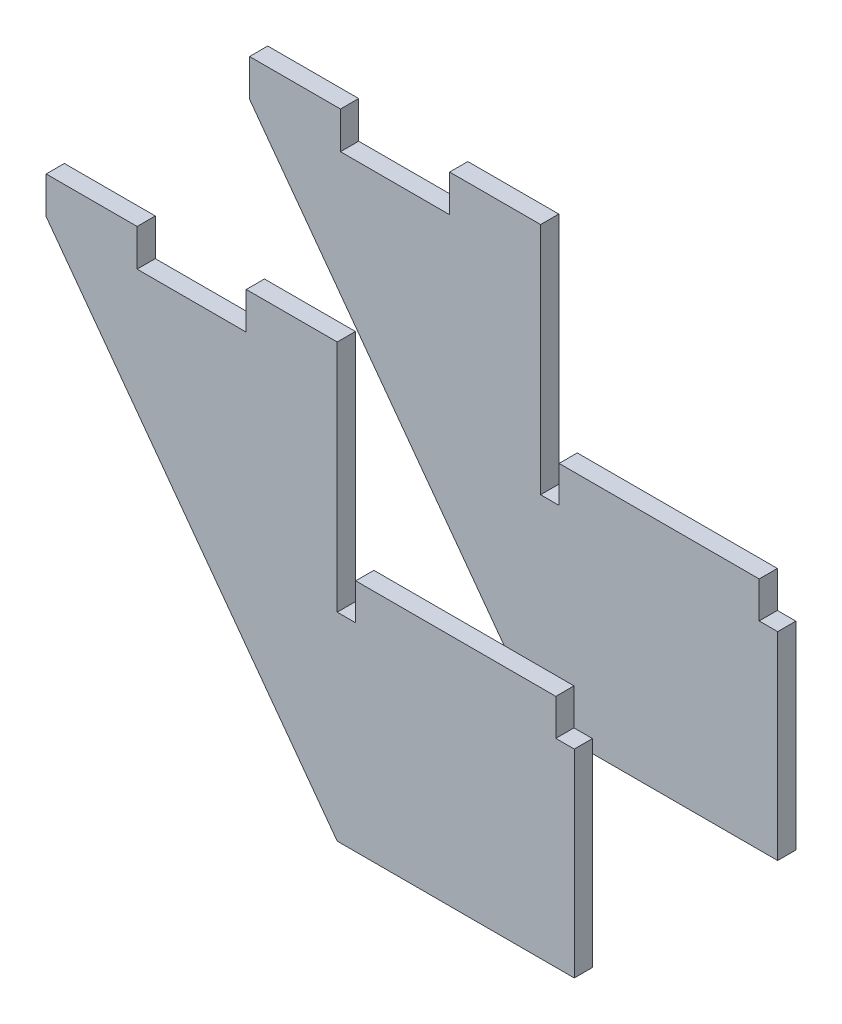
ISO-10303-21;
HEADER;
FILE_DESCRIPTION(('STEP AP214'),'2;1');
FILE_NAME('part.step','',(''),(''),'','','');
FILE_SCHEMA(('AUTOMOTIVE_DESIGN { 1 0 10303 214 1 1 1 1 }'));
ENDSEC;
DATA;
#1=APPLICATION_CONTEXT('core data for automotive mechanical design processes');
#2=APPLICATION_PROTOCOL_DEFINITION('international standard','automotive_design',2000,#1);
#3=PRODUCT_CONTEXT('',#1,'mechanical');
#4=PRODUCT('Part','Part','',(#3));
#5=PRODUCT_RELATED_PRODUCT_CATEGORY('part','',(#4));
#6=PRODUCT_DEFINITION_FORMATION('','',#4);
#7=PRODUCT_DEFINITION_CONTEXT('part definition',#1,'design');
#8=PRODUCT_DEFINITION('design','',#6,#7);
#9=PRODUCT_DEFINITION_SHAPE('','',#8);
#10=(LENGTH_UNIT() NAMED_UNIT(*) SI_UNIT(.MILLI.,.METRE.));
#11=(NAMED_UNIT(*) PLANE_ANGLE_UNIT() SI_UNIT($,.RADIAN.));
#12=(NAMED_UNIT(*) SI_UNIT($,.STERADIAN.) SOLID_ANGLE_UNIT());
#13=UNCERTAINTY_MEASURE_WITH_UNIT(LENGTH_MEASURE(1.E-05),#10,'distance_accuracy_value','');
#14=(GEOMETRIC_REPRESENTATION_CONTEXT(3) GLOBAL_UNCERTAINTY_ASSIGNED_CONTEXT((#13)) GLOBAL_UNIT_ASSIGNED_CONTEXT((#10,
#11,#12)) REPRESENTATION_CONTEXT('',''));
#15=CARTESIAN_POINT('',(0.,0.,0.));
#16=DIRECTION('',(0.,0.,1.));
#17=DIRECTION('',(1.,0.,0.));
#18=AXIS2_PLACEMENT_3D('',#15,#16,#17);
#19=CARTESIAN_POINT('',(-200.,-2270.2189218341,125.085497620243));
#20=DIRECTION('',(1.,0.,0.));
#21=DIRECTION('',(0.,0.,-1.));
#22=AXIS2_PLACEMENT_3D('',#19,#20,#21);
#23=PLANE('',#22);
#24=DIRECTION('',(0.,1.,0.));
#25=VECTOR('',#24,1.);
#26=CARTESIAN_POINT('',(-200.,-2270.2189218341,135.085497620243));
#27=LINE('',#26,#25);
#28=CARTESIAN_POINT('',(-200.,-2161.21892183411,135.085497620243));
#29=VERTEX_POINT('',#28);
#30=CARTESIAN_POINT('',(-200.,-2141.21892183411,135.085497620243));
#31=VERTEX_POINT('',#30);
#32=EDGE_CURVE('E185',#29,#31,#27,.T.);
#33=ORIENTED_EDGE('',*,*,#32,.T.);
#34=DIRECTION('',(0.,0.,1.));
#35=VECTOR('',#34,1.);
#36=CARTESIAN_POINT('',(-200.,-2141.21892183411,125.085497620243));
#37=LINE('',#36,#35);
#38=CARTESIAN_POINT('',(-200.,-2141.21892183411,125.085497620243));
#39=VERTEX_POINT('',#38);
#40=EDGE_CURVE('E12',#39,#31,#37,.T.);
#41=ORIENTED_EDGE('',*,*,#40,.F.);
#42=DIRECTION('',(0.,1.,0.));
#43=VECTOR('',#42,1.);
#44=CARTESIAN_POINT('',(-200.,-2270.2189218341,125.085497620243));
#45=LINE('',#44,#43);
#46=CARTESIAN_POINT('',(-200.,-2161.21892183411,125.085497620243));
#47=VERTEX_POINT('',#46);
#48=EDGE_CURVE('E213',#47,#39,#45,.T.);
#49=ORIENTED_EDGE('',*,*,#48,.F.);
#50=DIRECTION('',(0.,0.,1.));
#51=VECTOR('',#50,1.);
#52=CARTESIAN_POINT('',(-200.,-2161.21892183411,125.085497620243));
#53=LINE('',#52,#51);
#54=EDGE_CURVE('E181',#47,#29,#53,.T.);
#55=ORIENTED_EDGE('',*,*,#54,.T.);
#56=EDGE_LOOP('',(#33,#41,#49,#55));
#57=FACE_BOUND('',#56,.T.);
#58=ADVANCED_FACE('F47',(#57),#23,.F.);
#59=CARTESIAN_POINT('',(-200.,-2141.21892183411,125.085497620243));
#60=DIRECTION('',(0.,-1.,0.));
#61=DIRECTION('',(0.,0.,-1.));
#62=AXIS2_PLACEMENT_3D('',#59,#60,#61);
#63=PLANE('',#62);
#64=DIRECTION('',(1.,0.,0.));
#65=VECTOR('',#64,1.);
#66=CARTESIAN_POINT('',(-200.,-2141.21892183411,135.085497620243));
#67=LINE('',#66,#65);
#68=CARTESIAN_POINT('',(-90.,-2141.21892183411,135.085497620243));
#69=VERTEX_POINT('',#68);
#70=EDGE_CURVE('E188',#31,#69,#67,.T.);
#71=ORIENTED_EDGE('',*,*,#70,.T.);
#72=DIRECTION('',(0.,0.,1.));
#73=VECTOR('',#72,1.);
#74=CARTESIAN_POINT('',(-90.,-2141.21892183411,125.085497620243));
#75=LINE('',#74,#73);
#76=CARTESIAN_POINT('',(-90.,-2141.21892183411,125.085497620243));
#77=VERTEX_POINT('',#76);
#78=EDGE_CURVE('E55',#77,#69,#75,.T.);
#79=ORIENTED_EDGE('',*,*,#78,.F.);
#80=DIRECTION('',(1.,0.,0.));
#81=VECTOR('',#80,1.);
#82=CARTESIAN_POINT('',(-200.,-2141.21892183411,125.085497620243));
#83=LINE('',#82,#81);
#84=EDGE_CURVE('E126',#39,#77,#83,.T.);
#85=ORIENTED_EDGE('',*,*,#84,.F.);
#86=ORIENTED_EDGE('',*,*,#40,.T.);
#87=EDGE_LOOP('',(#71,#79,#85,#86));
#88=FACE_BOUND('',#87,.T.);
#89=ADVANCED_FACE('F306',(#88),#63,.F.);
#90=CARTESIAN_POINT('',(-90.,-2270.2189218341,125.085497620243));
#91=DIRECTION('',(-1.,0.,0.));
#92=DIRECTION('',(0.,0.,1.));
#93=AXIS2_PLACEMENT_3D('',#90,#91,#92);
#94=PLANE('',#93);
#95=DIRECTION('',(0.,-1.,0.));
#96=VECTOR('',#95,1.);
#97=CARTESIAN_POINT('',(-90.,-2270.2189218341,135.085497620243));
#98=LINE('',#97,#96);
#99=CARTESIAN_POINT('',(-90.,-2161.21892183411,135.085497620243));
#100=VERTEX_POINT('',#99);
#101=EDGE_CURVE('E190',#69,#100,#98,.T.);
#102=ORIENTED_EDGE('',*,*,#101,.T.);
#103=DIRECTION('',(0.,0.,1.));
#104=VECTOR('',#103,1.);
#105=CARTESIAN_POINT('',(-90.,-2161.21892183411,125.085497620243));
#106=LINE('',#105,#104);
#107=CARTESIAN_POINT('',(-90.,-2161.21892183411,125.085497620243));
#108=VERTEX_POINT('',#107);
#109=EDGE_CURVE('E241',#108,#100,#106,.T.);
#110=ORIENTED_EDGE('',*,*,#109,.F.);
#111=DIRECTION('',(0.,-1.,0.));
#112=VECTOR('',#111,1.);
#113=CARTESIAN_POINT('',(-90.,-2270.2189218341,125.085497620243));
#114=LINE('',#113,#112);
#115=EDGE_CURVE('E249',#77,#108,#114,.T.);
#116=ORIENTED_EDGE('',*,*,#115,.F.);
#117=ORIENTED_EDGE('',*,*,#78,.T.);
#118=EDGE_LOOP('',(#102,#110,#116,#117));
#119=FACE_BOUND('',#118,.T.);
#120=ADVANCED_FACE('F247',(#119),#94,.F.);
#121=CARTESIAN_POINT('',(-200.000000000005,-2161.21892183411,125.085497620243));
#122=DIRECTION('',(0.,-1.,0.));
#123=DIRECTION('',(1.,0.,0.));
#124=AXIS2_PLACEMENT_3D('',#121,#122,#123);
#125=PLANE('',#124);
#126=DIRECTION('',(1.,0.,0.));
#127=VECTOR('',#126,1.);
#128=CARTESIAN_POINT('',(-200.000000000005,-2161.21892183411,135.085497620243));
#129=LINE('',#128,#127);
#130=CARTESIAN_POINT('',(-79.84,-2161.21892183411,135.085497620243));
#131=VERTEX_POINT('',#130);
#132=EDGE_CURVE('E192',#100,#131,#129,.T.);
#133=ORIENTED_EDGE('',*,*,#132,.T.);
#134=DIRECTION('',(0.,0.,1.));
#135=VECTOR('',#134,1.);
#136=CARTESIAN_POINT('',(-79.84,-2161.21892183411,125.085497620243));
#137=LINE('',#136,#135);
#138=CARTESIAN_POINT('',(-79.84,-2161.21892183411,125.085497620243));
#139=VERTEX_POINT('',#138);
#140=EDGE_CURVE('E238',#139,#131,#137,.T.);
#141=ORIENTED_EDGE('',*,*,#140,.F.);
#142=DIRECTION('',(1.,0.,0.));
#143=VECTOR('',#142,1.);
#144=CARTESIAN_POINT('',(-200.000000000005,-2161.21892183411,125.085497620243));
#145=LINE('',#144,#143);
#146=EDGE_CURVE('E267',#108,#139,#145,.T.);
#147=ORIENTED_EDGE('',*,*,#146,.F.);
#148=ORIENTED_EDGE('',*,*,#109,.T.);
#149=EDGE_LOOP('',(#133,#141,#147,#148));
#150=FACE_BOUND('',#149,.T.);
#151=ADVANCED_FACE('F258',(#150),#125,.F.);
#152=CARTESIAN_POINT('',(-79.84,-2270.2189218341,125.085497620243));
#153=DIRECTION('',(-1.,0.,0.));
#154=DIRECTION('',(0.,0.,1.));
#155=AXIS2_PLACEMENT_3D('',#152,#153,#154);
#156=PLANE('',#155);
#157=DIRECTION('',(0.,-1.,0.));
#158=VECTOR('',#157,1.);
#159=CARTESIAN_POINT('',(-79.84,-2270.2189218341,135.085497620243));
#160=LINE('',#159,#158);
#161=CARTESIAN_POINT('',(-79.84,-2270.21892183411,135.085497620243));
#162=VERTEX_POINT('',#161);
#163=EDGE_CURVE('E194',#131,#162,#160,.T.);
#164=ORIENTED_EDGE('',*,*,#163,.T.);
#165=DIRECTION('',(0.,0.,1.));
#166=VECTOR('',#165,1.);
#167=CARTESIAN_POINT('',(-79.84,-2270.21892183411,125.085497620243));
#168=LINE('',#167,#166);
#169=CARTESIAN_POINT('',(-79.84,-2270.21892183411,125.085497620243));
#170=VERTEX_POINT('',#169);
#171=EDGE_CURVE('E235',#170,#162,#168,.T.);
#172=ORIENTED_EDGE('',*,*,#171,.F.);
#173=DIRECTION('',(0.,-1.,0.));
#174=VECTOR('',#173,1.);
#175=CARTESIAN_POINT('',(-79.84,-2270.2189218341,125.085497620243));
#176=LINE('',#175,#174);
#177=EDGE_CURVE('E264',#139,#170,#176,.T.);
#178=ORIENTED_EDGE('',*,*,#177,.F.);
#179=ORIENTED_EDGE('',*,*,#140,.T.);
#180=EDGE_LOOP('',(#164,#172,#178,#179));
#181=FACE_BOUND('',#180,.T.);
#182=ADVANCED_FACE('F262',(#181),#156,.F.);
#183=CARTESIAN_POINT('',(-200.,-2270.21892183411,125.085497620243));
#184=DIRECTION('',(0.,1.,0.));
#185=DIRECTION('',(0.,0.,1.));
#186=AXIS2_PLACEMENT_3D('',#183,#184,#185);
#187=PLANE('',#186);
#188=DIRECTION('',(-1.,0.,0.));
#189=VECTOR('',#188,1.);
#190=CARTESIAN_POINT('',(-200.,-2270.21892183411,135.085497620243));
#191=LINE('',#190,#189);
#192=CARTESIAN_POINT('',(-210.16,-2270.21892183411,135.085497620243));
#193=VERTEX_POINT('',#192);
#194=EDGE_CURVE('E196',#162,#193,#191,.T.);
#195=ORIENTED_EDGE('',*,*,#194,.T.);
#196=DIRECTION('',(0.,0.,1.));
#197=VECTOR('',#196,1.);
#198=CARTESIAN_POINT('',(-210.16,-2270.21892183411,125.085497620243));
#199=LINE('',#198,#197);
#200=CARTESIAN_POINT('',(-210.16,-2270.21892183411,125.085497620243));
#201=VERTEX_POINT('',#200);
#202=EDGE_CURVE('E232',#201,#193,#199,.T.);
#203=ORIENTED_EDGE('',*,*,#202,.F.);
#204=DIRECTION('',(-1.,0.,0.));
#205=VECTOR('',#204,1.);
#206=CARTESIAN_POINT('',(-200.,-2270.21892183411,125.085497620243));
#207=LINE('',#206,#205);
#208=EDGE_CURVE('E266',#170,#201,#207,.T.);
#209=ORIENTED_EDGE('',*,*,#208,.F.);
#210=ORIENTED_EDGE('',*,*,#171,.T.);
#211=EDGE_LOOP('',(#195,#203,#209,#210));
#212=FACE_BOUND('',#211,.T.);
#213=ADVANCED_FACE('F319',(#212),#187,.F.);
#214=CARTESIAN_POINT('',(-206.588355669913,-2275.06982516988,125.085497620243));
#215=DIRECTION('',(0.805270267507445,0.592907915505003,0.));
#216=DIRECTION('',(-0.592907915505003,0.805270267507445,0.));
#217=AXIS2_PLACEMENT_3D('',#214,#215,#216);
#218=PLANE('',#217);
#219=DIRECTION('',(-0.592907915505003,0.805270267507445,0.));
#220=VECTOR('',#219,1.);
#221=CARTESIAN_POINT('',(-206.588355669913,-2275.06982516988,135.085497620243));
#222=LINE('',#221,#220);
#223=CARTESIAN_POINT('',(-370.16,-2052.91158045471,135.085497620243));
#224=VERTEX_POINT('',#223);
#225=EDGE_CURVE('E198',#193,#224,#222,.T.);
#226=ORIENTED_EDGE('',*,*,#225,.T.);
#227=DIRECTION('',(0.,0.,1.));
#228=VECTOR('',#227,1.);
#229=CARTESIAN_POINT('',(-370.16,-2052.91158045471,125.085497620243));
#230=LINE('',#229,#228);
#231=CARTESIAN_POINT('',(-370.16,-2052.91158045471,125.085497620243));
#232=VERTEX_POINT('',#231);
#233=EDGE_CURVE('E229',#232,#224,#230,.T.);
#234=ORIENTED_EDGE('',*,*,#233,.F.);
#235=DIRECTION('',(-0.592907915505003,0.805270267507445,0.));
#236=VECTOR('',#235,1.);
#237=CARTESIAN_POINT('',(-206.588355669913,-2275.06982516988,125.085497620243));
#238=LINE('',#237,#236);
#239=EDGE_CURVE('E269',#201,#232,#238,.T.);
#240=ORIENTED_EDGE('',*,*,#239,.F.);
#241=ORIENTED_EDGE('',*,*,#202,.T.);
#242=EDGE_LOOP('',(#226,#234,#240,#241));
#243=FACE_BOUND('',#242,.T.);
#244=ADVANCED_FACE('F322',(#243),#218,.F.);
#245=CARTESIAN_POINT('',(-370.16,-2270.2189218341,125.085497620243));
#246=DIRECTION('',(1.,0.,0.));
#247=DIRECTION('',(0.,0.,-1.));
#248=AXIS2_PLACEMENT_3D('',#245,#246,#247);
#249=PLANE('',#248);
#250=DIRECTION('',(0.,1.,0.));
#251=VECTOR('',#250,1.);
#252=CARTESIAN_POINT('',(-370.16,-2270.2189218341,135.085497620243));
#253=LINE('',#252,#251);
#254=CARTESIAN_POINT('',(-370.16,-2032.59158045471,135.085497620243));
#255=VERTEX_POINT('',#254);
#256=EDGE_CURVE('E200',#224,#255,#253,.T.);
#257=ORIENTED_EDGE('',*,*,#256,.T.);
#258=DIRECTION('',(0.,0.,1.));
#259=VECTOR('',#258,1.);
#260=CARTESIAN_POINT('',(-370.16,-2032.59158045471,125.085497620243));
#261=LINE('',#260,#259);
#262=CARTESIAN_POINT('',(-370.16,-2032.59158045471,125.085497620243));
#263=VERTEX_POINT('',#262);
#264=EDGE_CURVE('E226',#263,#255,#261,.T.);
#265=ORIENTED_EDGE('',*,*,#264,.F.);
#266=DIRECTION('',(0.,1.,0.));
#267=VECTOR('',#266,1.);
#268=CARTESIAN_POINT('',(-370.16,-2270.2189218341,125.085497620243));
#269=LINE('',#268,#267);
#270=EDGE_CURVE('E275',#232,#263,#269,.T.);
#271=ORIENTED_EDGE('',*,*,#270,.F.);
#272=ORIENTED_EDGE('',*,*,#233,.T.);
#273=EDGE_LOOP('',(#257,#265,#271,#272));
#274=FACE_BOUND('',#273,.T.);
#275=ADVANCED_FACE('F326',(#274),#249,.F.);
#276=CARTESIAN_POINT('',(-200.,-2032.59158045471,125.085497620243));
#277=DIRECTION('',(0.,-1.,0.));
#278=DIRECTION('',(0.,0.,-1.));
#279=AXIS2_PLACEMENT_3D('',#276,#277,#278);
#280=PLANE('',#279);
#281=DIRECTION('',(1.,0.,0.));
#282=VECTOR('',#281,1.);
#283=CARTESIAN_POINT('',(-200.,-2032.59158045471,135.085497620243));
#284=LINE('',#283,#282);
#285=CARTESIAN_POINT('',(-320.16,-2032.59158045471,135.085497620243));
#286=VERTEX_POINT('',#285);
#287=EDGE_CURVE('E202',#255,#286,#284,.T.);
#288=ORIENTED_EDGE('',*,*,#287,.T.);
#289=DIRECTION('',(0.,0.,1.));
#290=VECTOR('',#289,1.);
#291=CARTESIAN_POINT('',(-320.16,-2032.59158045471,125.085497620243));
#292=LINE('',#291,#290);
#293=CARTESIAN_POINT('',(-320.16,-2032.59158045471,125.085497620243));
#294=VERTEX_POINT('',#293);
#295=EDGE_CURVE('E223',#294,#286,#292,.T.);
#296=ORIENTED_EDGE('',*,*,#295,.F.);
#297=DIRECTION('',(1.,0.,0.));
#298=VECTOR('',#297,1.);
#299=CARTESIAN_POINT('',(-200.,-2032.59158045471,125.085497620243));
#300=LINE('',#299,#298);
#301=EDGE_CURVE('E277',#263,#294,#300,.T.);
#302=ORIENTED_EDGE('',*,*,#301,.F.);
#303=ORIENTED_EDGE('',*,*,#264,.T.);
#304=EDGE_LOOP('',(#288,#296,#302,#303));
#305=FACE_BOUND('',#304,.T.);
#306=ADVANCED_FACE('F330',(#305),#280,.F.);
#307=CARTESIAN_POINT('',(-320.16,-2270.2189218341,125.085497620243));
#308=DIRECTION('',(-1.,0.,0.));
#309=DIRECTION('',(0.,0.,1.));
#310=AXIS2_PLACEMENT_3D('',#307,#308,#309);
#311=PLANE('',#310);
#312=DIRECTION('',(0.,-1.,0.));
#313=VECTOR('',#312,1.);
#314=CARTESIAN_POINT('',(-320.16,-2270.2189218341,135.085497620243));
#315=LINE('',#314,#313);
#316=CARTESIAN_POINT('',(-320.16,-2052.91158045471,135.085497620243));
#317=VERTEX_POINT('',#316);
#318=EDGE_CURVE('E204',#286,#317,#315,.T.);
#319=ORIENTED_EDGE('',*,*,#318,.T.);
#320=DIRECTION('',(0.,0.,1.));
#321=VECTOR('',#320,1.);
#322=CARTESIAN_POINT('',(-320.16,-2052.91158045471,125.085497620243));
#323=LINE('',#322,#321);
#324=CARTESIAN_POINT('',(-320.16,-2052.91158045471,125.085497620243));
#325=VERTEX_POINT('',#324);
#326=EDGE_CURVE('E220',#325,#317,#323,.T.);
#327=ORIENTED_EDGE('',*,*,#326,.F.);
#328=DIRECTION('',(0.,-1.,0.));
#329=VECTOR('',#328,1.);
#330=CARTESIAN_POINT('',(-320.16,-2270.2189218341,125.085497620243));
#331=LINE('',#330,#329);
#332=EDGE_CURVE('E279',#294,#325,#331,.T.);
#333=ORIENTED_EDGE('',*,*,#332,.F.);
#334=ORIENTED_EDGE('',*,*,#295,.T.);
#335=EDGE_LOOP('',(#319,#327,#333,#334));
#336=FACE_BOUND('',#335,.T.);
#337=ADVANCED_FACE('F334',(#336),#311,.F.);
#338=CARTESIAN_POINT('',(-200.,-2052.91158045471,125.085497620243));
#339=DIRECTION('',(0.,-1.,0.));
#340=DIRECTION('',(0.,0.,-1.));
#341=AXIS2_PLACEMENT_3D('',#338,#339,#340);
#342=PLANE('',#341);
#343=DIRECTION('',(1.,0.,0.));
#344=VECTOR('',#343,1.);
#345=CARTESIAN_POINT('',(-200.,-2052.91158045471,135.085497620243));
#346=LINE('',#345,#344);
#347=CARTESIAN_POINT('',(-260.16,-2052.91158045471,135.085497620243));
#348=VERTEX_POINT('',#347);
#349=EDGE_CURVE('E206',#317,#348,#346,.T.);
#350=ORIENTED_EDGE('',*,*,#349,.T.);
#351=DIRECTION('',(0.,0.,1.));
#352=VECTOR('',#351,1.);
#353=CARTESIAN_POINT('',(-260.16,-2052.91158045471,125.085497620243));
#354=LINE('',#353,#352);
#355=CARTESIAN_POINT('',(-260.16,-2052.91158045471,125.085497620243));
#356=VERTEX_POINT('',#355);
#357=EDGE_CURVE('E217',#356,#348,#354,.T.);
#358=ORIENTED_EDGE('',*,*,#357,.F.);
#359=DIRECTION('',(1.,0.,0.));
#360=VECTOR('',#359,1.);
#361=CARTESIAN_POINT('',(-200.,-2052.91158045471,125.085497620243));
#362=LINE('',#361,#360);
#363=EDGE_CURVE('E281',#325,#356,#362,.T.);
#364=ORIENTED_EDGE('',*,*,#363,.F.);
#365=ORIENTED_EDGE('',*,*,#326,.T.);
#366=EDGE_LOOP('',(#350,#358,#364,#365));
#367=FACE_BOUND('',#366,.T.);
#368=ADVANCED_FACE('F287',(#367),#342,.F.);
#369=CARTESIAN_POINT('',(-260.160000000001,-2270.2189218341,125.085497620243));
#370=DIRECTION('',(1.,0.,0.));
#371=DIRECTION('',(0.,1.,0.));
#372=AXIS2_PLACEMENT_3D('',#369,#370,#371);
#373=PLANE('',#372);
#374=DIRECTION('',(0.,1.,0.));
#375=VECTOR('',#374,1.);
#376=CARTESIAN_POINT('',(-260.160000000001,-2270.2189218341,135.085497620243));
#377=LINE('',#376,#375);
#378=CARTESIAN_POINT('',(-260.16,-2032.59158045471,135.085497620243));
#379=VERTEX_POINT('',#378);
#380=EDGE_CURVE('E208',#348,#379,#377,.T.);
#381=ORIENTED_EDGE('',*,*,#380,.T.);
#382=DIRECTION('',(0.,0.,1.));
#383=VECTOR('',#382,1.);
#384=CARTESIAN_POINT('',(-260.16,-2032.59158045471,125.085497620243));
#385=LINE('',#384,#383);
#386=CARTESIAN_POINT('',(-260.16,-2032.59158045471,125.085497620243));
#387=VERTEX_POINT('',#386);
#388=EDGE_CURVE('E176',#387,#379,#385,.T.);
#389=ORIENTED_EDGE('',*,*,#388,.F.);
#390=DIRECTION('',(0.,1.,0.));
#391=VECTOR('',#390,1.);
#392=CARTESIAN_POINT('',(-260.160000000001,-2270.2189218341,125.085497620243));
#393=LINE('',#392,#391);
#394=EDGE_CURVE('E166',#356,#387,#393,.T.);
#395=ORIENTED_EDGE('',*,*,#394,.F.);
#396=ORIENTED_EDGE('',*,*,#357,.T.);
#397=EDGE_LOOP('',(#381,#389,#395,#396));
#398=FACE_BOUND('',#397,.T.);
#399=ADVANCED_FACE('F291',(#398),#373,.F.);
#400=CARTESIAN_POINT('',(-199.999999999996,-2032.59158045471,125.085497620243));
#401=DIRECTION('',(0.,-1.,0.));
#402=DIRECTION('',(1.,0.,0.));
#403=AXIS2_PLACEMENT_3D('',#400,#401,#402);
#404=PLANE('',#403);
#405=DIRECTION('',(1.,0.,0.));
#406=VECTOR('',#405,1.);
#407=CARTESIAN_POINT('',(-199.999999999996,-2032.59158045471,135.085497620243));
#408=LINE('',#407,#406);
#409=CARTESIAN_POINT('',(-210.16,-2032.59158045471,135.085497620243));
#410=VERTEX_POINT('',#409);
#411=EDGE_CURVE('E175',#379,#410,#408,.T.);
#412=ORIENTED_EDGE('',*,*,#411,.T.);
#413=DIRECTION('',(0.,0.,1.));
#414=VECTOR('',#413,1.);
#415=CARTESIAN_POINT('',(-210.16,-2032.59158045471,125.085497620243));
#416=LINE('',#415,#414);
#417=CARTESIAN_POINT('',(-210.16,-2032.59158045471,125.085497620243));
#418=VERTEX_POINT('',#417);
#419=EDGE_CURVE('E172',#418,#410,#416,.T.);
#420=ORIENTED_EDGE('',*,*,#419,.F.);
#421=DIRECTION('',(1.,0.,0.));
#422=VECTOR('',#421,1.);
#423=CARTESIAN_POINT('',(-199.999999999996,-2032.59158045471,125.085497620243));
#424=LINE('',#423,#422);
#425=EDGE_CURVE('E160',#387,#418,#424,.T.);
#426=ORIENTED_EDGE('',*,*,#425,.F.);
#427=ORIENTED_EDGE('',*,*,#388,.T.);
#428=EDGE_LOOP('',(#412,#420,#426,#427));
#429=FACE_BOUND('',#428,.T.);
#430=ADVANCED_FACE('F173',(#429),#404,.F.);
#431=CARTESIAN_POINT('',(-210.16,-2270.2189218341,125.085497620243));
#432=DIRECTION('',(-1.,0.,0.));
#433=DIRECTION('',(0.,-1.,0.));
#434=AXIS2_PLACEMENT_3D('',#431,#432,#433);
#435=PLANE('',#434);
#436=DIRECTION('',(0.,-1.,0.));
#437=VECTOR('',#436,1.);
#438=CARTESIAN_POINT('',(-210.16,-2270.2189218341,135.085497620243));
#439=LINE('',#438,#437);
#440=CARTESIAN_POINT('',(-210.16,-2161.21892183411,135.085497620243));
#441=VERTEX_POINT('',#440);
#442=EDGE_CURVE('E112',#410,#441,#439,.T.);
#443=ORIENTED_EDGE('',*,*,#442,.T.);
#444=DIRECTION('',(0.,0.,1.));
#445=VECTOR('',#444,1.);
#446=CARTESIAN_POINT('',(-210.16,-2161.21892183411,125.085497620243));
#447=LINE('',#446,#445);
#448=CARTESIAN_POINT('',(-210.16,-2161.21892183411,125.085497620243));
#449=VERTEX_POINT('',#448);
#450=EDGE_CURVE('E177',#449,#441,#447,.T.);
#451=ORIENTED_EDGE('',*,*,#450,.F.);
#452=DIRECTION('',(0.,-1.,0.));
#453=VECTOR('',#452,1.);
#454=CARTESIAN_POINT('',(-210.16,-2270.2189218341,125.085497620243));
#455=LINE('',#454,#453);
#456=EDGE_CURVE('E164',#418,#449,#455,.T.);
#457=ORIENTED_EDGE('',*,*,#456,.F.);
#458=ORIENTED_EDGE('',*,*,#419,.T.);
#459=EDGE_LOOP('',(#443,#451,#457,#458));
#460=FACE_BOUND('',#459,.T.);
#461=ADVANCED_FACE('F179',(#460),#435,.F.);
#462=CARTESIAN_POINT('',(-199.999999999995,-2161.21892183411,125.085497620243));
#463=DIRECTION('',(0.,-1.,0.));
#464=DIRECTION('',(1.,0.,0.));
#465=AXIS2_PLACEMENT_3D('',#462,#463,#464);
#466=PLANE('',#465);
#467=DIRECTION('',(1.,0.,0.));
#468=VECTOR('',#467,1.);
#469=CARTESIAN_POINT('',(-199.999999999995,-2161.21892183411,135.085497620243));
#470=LINE('',#469,#468);
#471=EDGE_CURVE('E118',#441,#29,#470,.T.);
#472=ORIENTED_EDGE('',*,*,#471,.T.);
#473=ORIENTED_EDGE('',*,*,#54,.F.);
#474=DIRECTION('',(1.,0.,0.));
#475=VECTOR('',#474,1.);
#476=CARTESIAN_POINT('',(-199.999999999995,-2161.21892183411,125.085497620243));
#477=LINE('',#476,#475);
#478=EDGE_CURVE('E63',#449,#47,#477,.T.);
#479=ORIENTED_EDGE('',*,*,#478,.F.);
#480=ORIENTED_EDGE('',*,*,#450,.T.);
#481=EDGE_LOOP('',(#472,#473,#479,#480));
#482=FACE_BOUND('',#481,.T.);
#483=ADVANCED_FACE('F295',(#482),#466,.F.);
#484=CARTESIAN_POINT('',(0.,0.,125.085497620243));
#485=DIRECTION('',(0.,0.,-1.));
#486=DIRECTION('',(0.,1.,0.));
#487=AXIS2_PLACEMENT_3D('',#484,#485,#486);
#488=PLANE('',#487);
#489=ORIENTED_EDGE('',*,*,#48,.T.);
#490=ORIENTED_EDGE('',*,*,#84,.T.);
#491=ORIENTED_EDGE('',*,*,#115,.T.);
#492=ORIENTED_EDGE('',*,*,#146,.T.);
#493=ORIENTED_EDGE('',*,*,#177,.T.);
#494=ORIENTED_EDGE('',*,*,#208,.T.);
#495=ORIENTED_EDGE('',*,*,#239,.T.);
#496=ORIENTED_EDGE('',*,*,#270,.T.);
#497=ORIENTED_EDGE('',*,*,#301,.T.);
#498=ORIENTED_EDGE('',*,*,#332,.T.);
#499=ORIENTED_EDGE('',*,*,#363,.T.);
#500=ORIENTED_EDGE('',*,*,#394,.T.);
#501=ORIENTED_EDGE('',*,*,#425,.T.);
#502=ORIENTED_EDGE('',*,*,#456,.T.);
#503=ORIENTED_EDGE('',*,*,#478,.T.);
#504=EDGE_LOOP('',(#489,#490,#491,#492,#493,#494,#495,#496,#497,#498,#499,#500,#501,#502,#503));
#505=FACE_BOUND('',#504,.T.);
#506=ADVANCED_FACE('F162',(#505),#488,.T.);
#507=CARTESIAN_POINT('',(0.,0.,135.085497620243));
#508=DIRECTION('',(0.,0.,-1.));
#509=DIRECTION('',(0.,1.,0.));
#510=AXIS2_PLACEMENT_3D('',#507,#508,#509);
#511=PLANE('',#510);
#512=ORIENTED_EDGE('',*,*,#32,.F.);
#513=ORIENTED_EDGE('',*,*,#471,.F.);
#514=ORIENTED_EDGE('',*,*,#442,.F.);
#515=ORIENTED_EDGE('',*,*,#411,.F.);
#516=ORIENTED_EDGE('',*,*,#380,.F.);
#517=ORIENTED_EDGE('',*,*,#349,.F.);
#518=ORIENTED_EDGE('',*,*,#318,.F.);
#519=ORIENTED_EDGE('',*,*,#287,.F.);
#520=ORIENTED_EDGE('',*,*,#256,.F.);
#521=ORIENTED_EDGE('',*,*,#225,.F.);
#522=ORIENTED_EDGE('',*,*,#194,.F.);
#523=ORIENTED_EDGE('',*,*,#163,.F.);
#524=ORIENTED_EDGE('',*,*,#132,.F.);
#525=ORIENTED_EDGE('',*,*,#101,.F.);
#526=ORIENTED_EDGE('',*,*,#70,.F.);
#527=EDGE_LOOP('',(#512,#513,#514,#515,#516,#517,#518,#519,#520,#521,#522,#523,#524,#525,#526));
#528=FACE_BOUND('',#527,.T.);
#529=ADVANCED_FACE('F253',(#528),#511,.F.);
#530=CLOSED_SHELL('',(#58,#89,#120,#151,#182,#213,#244,#275,#306,#337,#368,#399,#430,#461,#483,
#506,#529));
#531=MANIFOLD_SOLID_BREP('B2',#530);
#532=CARTESIAN_POINT('',(-210.16,-2161.2189218341,246.89266387771));
#533=DIRECTION('',(-1.,0.,0.));
#534=DIRECTION('',(0.,-1.,0.));
#535=AXIS2_PLACEMENT_3D('',#532,#533,#534);
#536=PLANE('',#535);
#537=DIRECTION('',(0.,1.,0.));
#538=VECTOR('',#537,1.);
#539=CARTESIAN_POINT('',(-210.16,-2161.2189218341,236.89266387771));
#540=LINE('',#539,#538);
#541=CARTESIAN_POINT('',(-210.16,-2161.21892183411,236.89266387771));
#542=VERTEX_POINT('',#541);
#543=CARTESIAN_POINT('',(-210.16,-2032.59158045471,236.89266387771));
#544=VERTEX_POINT('',#543);
#545=EDGE_CURVE('E567',#542,#544,#540,.T.);
#546=ORIENTED_EDGE('',*,*,#545,.T.);
#547=DIRECTION('',(0.,0.,-1.));
#548=VECTOR('',#547,1.);
#549=CARTESIAN_POINT('',(-210.16,-2032.59158045471,246.89266387771));
#550=LINE('',#549,#548);
#551=CARTESIAN_POINT('',(-210.16,-2032.59158045471,246.89266387771));
#552=VERTEX_POINT('',#551);
#553=EDGE_CURVE('E45',#552,#544,#550,.T.);
#554=ORIENTED_EDGE('',*,*,#553,.F.);
#555=DIRECTION('',(0.,1.,0.));
#556=VECTOR('',#555,1.);
#557=CARTESIAN_POINT('',(-210.16,-2161.2189218341,246.89266387771));
#558=LINE('',#557,#556);
#559=CARTESIAN_POINT('',(-210.16,-2161.21892183411,246.89266387771));
#560=VERTEX_POINT('',#559);
#561=EDGE_CURVE('E573',#560,#552,#558,.T.);
#562=ORIENTED_EDGE('',*,*,#561,.F.);
#563=DIRECTION('',(0.,0.,-1.));
#564=VECTOR('',#563,1.);
#565=CARTESIAN_POINT('',(-210.16,-2161.21892183411,246.89266387771));
#566=LINE('',#565,#564);
#567=EDGE_CURVE('E628',#560,#542,#566,.T.);
#568=ORIENTED_EDGE('',*,*,#567,.T.);
#569=EDGE_LOOP('',(#546,#554,#562,#568));
#570=FACE_BOUND('',#569,.T.);
#571=ADVANCED_FACE('F494',(#570),#536,.F.);
#572=CARTESIAN_POINT('',(-199.999999999998,-2032.59158045471,246.89266387771));
#573=DIRECTION('',(0.,-1.,0.));
#574=DIRECTION('',(1.,0.,0.));
#575=AXIS2_PLACEMENT_3D('',#572,#573,#574);
#576=PLANE('',#575);
#577=DIRECTION('',(-1.,0.,0.));
#578=VECTOR('',#577,1.);
#579=CARTESIAN_POINT('',(-199.999999999998,-2032.59158045471,236.89266387771));
#580=LINE('',#579,#578);
#581=CARTESIAN_POINT('',(-260.16,-2032.59158045471,236.89266387771));
#582=VERTEX_POINT('',#581);
#583=EDGE_CURVE('E633',#544,#582,#580,.T.);
#584=ORIENTED_EDGE('',*,*,#583,.T.);
#585=DIRECTION('',(0.,0.,-1.));
#586=VECTOR('',#585,1.);
#587=CARTESIAN_POINT('',(-260.16,-2032.59158045471,246.89266387771));
#588=LINE('',#587,#586);
#589=CARTESIAN_POINT('',(-260.16,-2032.59158045471,246.89266387771));
#590=VERTEX_POINT('',#589);
#591=EDGE_CURVE('E502',#590,#582,#588,.T.);
#592=ORIENTED_EDGE('',*,*,#591,.F.);
#593=DIRECTION('',(-1.,0.,0.));
#594=VECTOR('',#593,1.);
#595=CARTESIAN_POINT('',(-199.999999999998,-2032.59158045471,246.89266387771));
#596=LINE('',#595,#594);
#597=EDGE_CURVE('E742',#552,#590,#596,.T.);
#598=ORIENTED_EDGE('',*,*,#597,.F.);
#599=ORIENTED_EDGE('',*,*,#553,.T.);
#600=EDGE_LOOP('',(#584,#592,#598,#599));
#601=FACE_BOUND('',#600,.T.);
#602=ADVANCED_FACE('F745',(#601),#576,.F.);
#603=CARTESIAN_POINT('',(-260.16,-2161.2189218341,246.89266387771));
#604=DIRECTION('',(1.,0.,0.));
#605=DIRECTION('',(0.,1.,0.));
#606=AXIS2_PLACEMENT_3D('',#603,#604,#605);
#607=PLANE('',#606);
#608=DIRECTION('',(0.,-1.,0.));
#609=VECTOR('',#608,1.);
#610=CARTESIAN_POINT('',(-260.16,-2161.2189218341,236.89266387771));
#611=LINE('',#610,#609);
#612=CARTESIAN_POINT('',(-260.16,-2052.91158045471,236.89266387771));
#613=VERTEX_POINT('',#612);
#614=EDGE_CURVE('E635',#582,#613,#611,.T.);
#615=ORIENTED_EDGE('',*,*,#614,.T.);
#616=DIRECTION('',(0.,0.,-1.));
#617=VECTOR('',#616,1.);
#618=CARTESIAN_POINT('',(-260.16,-2052.91158045471,246.89266387771));
#619=LINE('',#618,#617);
#620=CARTESIAN_POINT('',(-260.16,-2052.91158045471,246.89266387771));
#621=VERTEX_POINT('',#620);
#622=EDGE_CURVE('E687',#621,#613,#619,.T.);
#623=ORIENTED_EDGE('',*,*,#622,.F.);
#624=DIRECTION('',(0.,-1.,0.));
#625=VECTOR('',#624,1.);
#626=CARTESIAN_POINT('',(-260.16,-2161.2189218341,246.89266387771));
#627=LINE('',#626,#625);
#628=EDGE_CURVE('E696',#590,#621,#627,.T.);
#629=ORIENTED_EDGE('',*,*,#628,.F.);
#630=ORIENTED_EDGE('',*,*,#591,.T.);
#631=EDGE_LOOP('',(#615,#623,#629,#630));
#632=FACE_BOUND('',#631,.T.);
#633=ADVANCED_FACE('F694',(#632),#607,.F.);
#634=CARTESIAN_POINT('',(-200.,-2052.91158045471,246.89266387771));
#635=DIRECTION('',(0.,-1.,0.));
#636=DIRECTION('',(0.,0.,-1.));
#637=AXIS2_PLACEMENT_3D('',#634,#635,#636);
#638=PLANE('',#637);
#639=DIRECTION('',(-1.,0.,0.));
#640=VECTOR('',#639,1.);
#641=CARTESIAN_POINT('',(-200.,-2052.91158045471,236.89266387771));
#642=LINE('',#641,#640);
#643=CARTESIAN_POINT('',(-320.16,-2052.91158045471,236.89266387771));
#644=VERTEX_POINT('',#643);
#645=EDGE_CURVE('E637',#613,#644,#642,.T.);
#646=ORIENTED_EDGE('',*,*,#645,.T.);
#647=DIRECTION('',(0.,0.,-1.));
#648=VECTOR('',#647,1.);
#649=CARTESIAN_POINT('',(-320.16,-2052.91158045471,246.89266387771));
#650=LINE('',#649,#648);
#651=CARTESIAN_POINT('',(-320.16,-2052.91158045471,246.89266387771));
#652=VERTEX_POINT('',#651);
#653=EDGE_CURVE('E684',#652,#644,#650,.T.);
#654=ORIENTED_EDGE('',*,*,#653,.F.);
#655=DIRECTION('',(-1.,0.,0.));
#656=VECTOR('',#655,1.);
#657=CARTESIAN_POINT('',(-200.,-2052.91158045471,246.89266387771));
#658=LINE('',#657,#656);
#659=EDGE_CURVE('E714',#621,#652,#658,.T.);
#660=ORIENTED_EDGE('',*,*,#659,.F.);
#661=ORIENTED_EDGE('',*,*,#622,.T.);
#662=EDGE_LOOP('',(#646,#654,#660,#661));
#663=FACE_BOUND('',#662,.T.);
#664=ADVANCED_FACE('F705',(#663),#638,.F.);
#665=CARTESIAN_POINT('',(-320.16,-2161.2189218341,246.89266387771));
#666=DIRECTION('',(-1.,0.,0.));
#667=DIRECTION('',(0.,0.,1.));
#668=AXIS2_PLACEMENT_3D('',#665,#666,#667);
#669=PLANE('',#668);
#670=DIRECTION('',(0.,1.,0.));
#671=VECTOR('',#670,1.);
#672=CARTESIAN_POINT('',(-320.16,-2161.2189218341,236.89266387771));
#673=LINE('',#672,#671);
#674=CARTESIAN_POINT('',(-320.16,-2032.59158045471,236.89266387771));
#675=VERTEX_POINT('',#674);
#676=EDGE_CURVE('E639',#644,#675,#673,.T.);
#677=ORIENTED_EDGE('',*,*,#676,.T.);
#678=DIRECTION('',(0.,0.,-1.));
#679=VECTOR('',#678,1.);
#680=CARTESIAN_POINT('',(-320.16,-2032.59158045471,246.89266387771));
#681=LINE('',#680,#679);
#682=CARTESIAN_POINT('',(-320.16,-2032.59158045471,246.89266387771));
#683=VERTEX_POINT('',#682);
#684=EDGE_CURVE('E681',#683,#675,#681,.T.);
#685=ORIENTED_EDGE('',*,*,#684,.F.);
#686=DIRECTION('',(0.,1.,0.));
#687=VECTOR('',#686,1.);
#688=CARTESIAN_POINT('',(-320.16,-2161.2189218341,246.89266387771));
#689=LINE('',#688,#687);
#690=EDGE_CURVE('E711',#652,#683,#689,.T.);
#691=ORIENTED_EDGE('',*,*,#690,.F.);
#692=ORIENTED_EDGE('',*,*,#653,.T.);
#693=EDGE_LOOP('',(#677,#685,#691,#692));
#694=FACE_BOUND('',#693,.T.);
#695=ADVANCED_FACE('F709',(#694),#669,.F.);
#696=CARTESIAN_POINT('',(-200.,-2032.59158045471,246.89266387771));
#697=DIRECTION('',(0.,-1.,0.));
#698=DIRECTION('',(0.,0.,-1.));
#699=AXIS2_PLACEMENT_3D('',#696,#697,#698);
#700=PLANE('',#699);
#701=DIRECTION('',(-1.,0.,0.));
#702=VECTOR('',#701,1.);
#703=CARTESIAN_POINT('',(-200.,-2032.59158045471,236.89266387771));
#704=LINE('',#703,#702);
#705=CARTESIAN_POINT('',(-370.16,-2032.59158045471,236.89266387771));
#706=VERTEX_POINT('',#705);
#707=EDGE_CURVE('E641',#675,#706,#704,.T.);
#708=ORIENTED_EDGE('',*,*,#707,.T.);
#709=DIRECTION('',(0.,0.,-1.));
#710=VECTOR('',#709,1.);
#711=CARTESIAN_POINT('',(-370.16,-2032.59158045471,246.89266387771));
#712=LINE('',#711,#710);
#713=CARTESIAN_POINT('',(-370.16,-2032.59158045471,246.89266387771));
#714=VERTEX_POINT('',#713);
#715=EDGE_CURVE('E678',#714,#706,#712,.T.);
#716=ORIENTED_EDGE('',*,*,#715,.F.);
#717=DIRECTION('',(-1.,0.,0.));
#718=VECTOR('',#717,1.);
#719=CARTESIAN_POINT('',(-200.,-2032.59158045471,246.89266387771));
#720=LINE('',#719,#718);
#721=EDGE_CURVE('E713',#683,#714,#720,.T.);
#722=ORIENTED_EDGE('',*,*,#721,.F.);
#723=ORIENTED_EDGE('',*,*,#684,.T.);
#724=EDGE_LOOP('',(#708,#716,#722,#723));
#725=FACE_BOUND('',#724,.T.);
#726=ADVANCED_FACE('F757',(#725),#700,.F.);
#727=CARTESIAN_POINT('',(-370.16,-2161.2189218341,246.89266387771));
#728=DIRECTION('',(1.,0.,0.));
#729=DIRECTION('',(0.,0.,-1.));
#730=AXIS2_PLACEMENT_3D('',#727,#728,#729);
#731=PLANE('',#730);
#732=DIRECTION('',(0.,-1.,0.));
#733=VECTOR('',#732,1.);
#734=CARTESIAN_POINT('',(-370.16,-2161.2189218341,236.89266387771));
#735=LINE('',#734,#733);
#736=CARTESIAN_POINT('',(-370.16,-2052.91158045471,236.89266387771));
#737=VERTEX_POINT('',#736);
#738=EDGE_CURVE('E643',#706,#737,#735,.T.);
#739=ORIENTED_EDGE('',*,*,#738,.T.);
#740=DIRECTION('',(0.,0.,-1.));
#741=VECTOR('',#740,1.);
#742=CARTESIAN_POINT('',(-370.16,-2052.91158045471,246.89266387771));
#743=LINE('',#742,#741);
#744=CARTESIAN_POINT('',(-370.16,-2052.91158045471,246.89266387771));
#745=VERTEX_POINT('',#744);
#746=EDGE_CURVE('E675',#745,#737,#743,.T.);
#747=ORIENTED_EDGE('',*,*,#746,.F.);
#748=DIRECTION('',(0.,-1.,0.));
#749=VECTOR('',#748,1.);
#750=CARTESIAN_POINT('',(-370.16,-2161.2189218341,246.89266387771));
#751=LINE('',#750,#749);
#752=EDGE_CURVE('E716',#714,#745,#751,.T.);
#753=ORIENTED_EDGE('',*,*,#752,.F.);
#754=ORIENTED_EDGE('',*,*,#715,.T.);
#755=EDGE_LOOP('',(#739,#747,#753,#754));
#756=FACE_BOUND('',#755,.T.);
#757=ADVANCED_FACE('F760',(#756),#731,.F.);
#758=CARTESIAN_POINT('',(-258.630527284046,-2204.38766296315,246.89266387771));
#759=DIRECTION('',(0.805270267507445,0.592907915505003,0.));
#760=DIRECTION('',(-0.592907915505003,0.805270267507445,0.));
#761=AXIS2_PLACEMENT_3D('',#758,#759,#760);
#762=PLANE('',#761);
#763=DIRECTION('',(0.592907915505003,-0.805270267507445,0.));
#764=VECTOR('',#763,1.);
#765=CARTESIAN_POINT('',(-258.630527284046,-2204.38766296315,236.89266387771));
#766=LINE('',#765,#764);
#767=CARTESIAN_POINT('',(-210.16,-2270.21892183411,236.89266387771));
#768=VERTEX_POINT('',#767);
#769=EDGE_CURVE('E645',#737,#768,#766,.T.);
#770=ORIENTED_EDGE('',*,*,#769,.T.);
#771=DIRECTION('',(0.,0.,-1.));
#772=VECTOR('',#771,1.);
#773=CARTESIAN_POINT('',(-210.16,-2270.21892183411,246.89266387771));
#774=LINE('',#773,#772);
#775=CARTESIAN_POINT('',(-210.16,-2270.21892183411,246.89266387771));
#776=VERTEX_POINT('',#775);
#777=EDGE_CURVE('E672',#776,#768,#774,.T.);
#778=ORIENTED_EDGE('',*,*,#777,.F.);
#779=DIRECTION('',(0.592907915505003,-0.805270267507445,0.));
#780=VECTOR('',#779,1.);
#781=CARTESIAN_POINT('',(-258.630527284046,-2204.38766296315,246.89266387771));
#782=LINE('',#781,#780);
#783=EDGE_CURVE('E722',#745,#776,#782,.T.);
#784=ORIENTED_EDGE('',*,*,#783,.F.);
#785=ORIENTED_EDGE('',*,*,#746,.T.);
#786=EDGE_LOOP('',(#770,#778,#784,#785));
#787=FACE_BOUND('',#786,.T.);
#788=ADVANCED_FACE('F764',(#787),#762,.F.);
#789=CARTESIAN_POINT('',(-200.,-2270.21892183411,246.89266387771));
#790=DIRECTION('',(0.,1.,0.));
#791=DIRECTION('',(0.,0.,1.));
#792=AXIS2_PLACEMENT_3D('',#789,#790,#791);
#793=PLANE('',#792);
#794=DIRECTION('',(1.,0.,0.));
#795=VECTOR('',#794,1.);
#796=CARTESIAN_POINT('',(-200.,-2270.21892183411,236.89266387771));
#797=LINE('',#796,#795);
#798=CARTESIAN_POINT('',(-79.84,-2270.21892183411,236.89266387771));
#799=VERTEX_POINT('',#798);
#800=EDGE_CURVE('E647',#768,#799,#797,.T.);
#801=ORIENTED_EDGE('',*,*,#800,.T.);
#802=DIRECTION('',(0.,0.,-1.));
#803=VECTOR('',#802,1.);
#804=CARTESIAN_POINT('',(-79.84,-2270.21892183411,246.89266387771));
#805=LINE('',#804,#803);
#806=CARTESIAN_POINT('',(-79.84,-2270.21892183411,246.89266387771));
#807=VERTEX_POINT('',#806);
#808=EDGE_CURVE('E669',#807,#799,#805,.T.);
#809=ORIENTED_EDGE('',*,*,#808,.F.);
#810=DIRECTION('',(1.,0.,0.));
#811=VECTOR('',#810,1.);
#812=CARTESIAN_POINT('',(-200.,-2270.21892183411,246.89266387771));
#813=LINE('',#812,#811);
#814=EDGE_CURVE('E724',#776,#807,#813,.T.);
#815=ORIENTED_EDGE('',*,*,#814,.F.);
#816=ORIENTED_EDGE('',*,*,#777,.T.);
#817=EDGE_LOOP('',(#801,#809,#815,#816));
#818=FACE_BOUND('',#817,.T.);
#819=ADVANCED_FACE('F768',(#818),#793,.F.);
#820=CARTESIAN_POINT('',(-79.84,-2161.2189218341,246.89266387771));
#821=DIRECTION('',(-1.,0.,0.));
#822=DIRECTION('',(0.,0.,1.));
#823=AXIS2_PLACEMENT_3D('',#820,#821,#822);
#824=PLANE('',#823);
#825=DIRECTION('',(0.,1.,0.));
#826=VECTOR('',#825,1.);
#827=CARTESIAN_POINT('',(-79.84,-2161.2189218341,236.89266387771));
#828=LINE('',#827,#826);
#829=CARTESIAN_POINT('',(-79.84,-2161.21892183411,236.89266387771));
#830=VERTEX_POINT('',#829);
#831=EDGE_CURVE('E649',#799,#830,#828,.T.);
#832=ORIENTED_EDGE('',*,*,#831,.T.);
#833=DIRECTION('',(0.,0.,-1.));
#834=VECTOR('',#833,1.);
#835=CARTESIAN_POINT('',(-79.84,-2161.21892183411,246.89266387771));
#836=LINE('',#835,#834);
#837=CARTESIAN_POINT('',(-79.84,-2161.21892183411,246.89266387771));
#838=VERTEX_POINT('',#837);
#839=EDGE_CURVE('E666',#838,#830,#836,.T.);
#840=ORIENTED_EDGE('',*,*,#839,.F.);
#841=DIRECTION('',(0.,1.,0.));
#842=VECTOR('',#841,1.);
#843=CARTESIAN_POINT('',(-79.84,-2161.2189218341,246.89266387771));
#844=LINE('',#843,#842);
#845=EDGE_CURVE('E726',#807,#838,#844,.T.);
#846=ORIENTED_EDGE('',*,*,#845,.F.);
#847=ORIENTED_EDGE('',*,*,#808,.T.);
#848=EDGE_LOOP('',(#832,#840,#846,#847));
#849=FACE_BOUND('',#848,.T.);
#850=ADVANCED_FACE('F772',(#849),#824,.F.);
#851=CARTESIAN_POINT('',(-200.,-2161.21892183411,246.89266387771));
#852=DIRECTION('',(0.,-1.,0.));
#853=DIRECTION('',(1.,0.,0.));
#854=AXIS2_PLACEMENT_3D('',#851,#852,#853);
#855=PLANE('',#854);
#856=DIRECTION('',(-1.,0.,0.));
#857=VECTOR('',#856,1.);
#858=CARTESIAN_POINT('',(-200.,-2161.21892183411,236.89266387771));
#859=LINE('',#858,#857);
#860=CARTESIAN_POINT('',(-90.,-2161.21892183411,236.89266387771));
#861=VERTEX_POINT('',#860);
#862=EDGE_CURVE('E651',#830,#861,#859,.T.);
#863=ORIENTED_EDGE('',*,*,#862,.T.);
#864=DIRECTION('',(0.,0.,-1.));
#865=VECTOR('',#864,1.);
#866=CARTESIAN_POINT('',(-90.,-2161.21892183411,246.89266387771));
#867=LINE('',#866,#865);
#868=CARTESIAN_POINT('',(-90.,-2161.21892183411,246.89266387771));
#869=VERTEX_POINT('',#868);
#870=EDGE_CURVE('E663',#869,#861,#867,.T.);
#871=ORIENTED_EDGE('',*,*,#870,.F.);
#872=DIRECTION('',(-1.,0.,0.));
#873=VECTOR('',#872,1.);
#874=CARTESIAN_POINT('',(-200.,-2161.21892183411,246.89266387771));
#875=LINE('',#874,#873);
#876=EDGE_CURVE('E728',#838,#869,#875,.T.);
#877=ORIENTED_EDGE('',*,*,#876,.F.);
#878=ORIENTED_EDGE('',*,*,#839,.T.);
#879=EDGE_LOOP('',(#863,#871,#877,#878));
#880=FACE_BOUND('',#879,.T.);
#881=ADVANCED_FACE('F734',(#880),#855,.F.);
#882=CARTESIAN_POINT('',(-90.,-2161.2189218341,246.89266387771));
#883=DIRECTION('',(-1.,0.,0.));
#884=DIRECTION('',(0.,0.,1.));
#885=AXIS2_PLACEMENT_3D('',#882,#883,#884);
#886=PLANE('',#885);
#887=DIRECTION('',(0.,1.,0.));
#888=VECTOR('',#887,1.);
#889=CARTESIAN_POINT('',(-90.,-2161.2189218341,236.89266387771));
#890=LINE('',#889,#888);
#891=CARTESIAN_POINT('',(-90.,-2141.21892183411,236.89266387771));
#892=VERTEX_POINT('',#891);
#893=EDGE_CURVE('E653',#861,#892,#890,.T.);
#894=ORIENTED_EDGE('',*,*,#893,.T.);
#895=DIRECTION('',(0.,0.,-1.));
#896=VECTOR('',#895,1.);
#897=CARTESIAN_POINT('',(-90.,-2141.21892183411,246.89266387771));
#898=LINE('',#897,#896);
#899=CARTESIAN_POINT('',(-90.,-2141.21892183411,246.89266387771));
#900=VERTEX_POINT('',#899);
#901=EDGE_CURVE('E623',#900,#892,#898,.T.);
#902=ORIENTED_EDGE('',*,*,#901,.F.);
#903=DIRECTION('',(0.,1.,0.));
#904=VECTOR('',#903,1.);
#905=CARTESIAN_POINT('',(-90.,-2161.2189218341,246.89266387771));
#906=LINE('',#905,#904);
#907=EDGE_CURVE('E614',#869,#900,#906,.T.);
#908=ORIENTED_EDGE('',*,*,#907,.F.);
#909=ORIENTED_EDGE('',*,*,#870,.T.);
#910=EDGE_LOOP('',(#894,#902,#908,#909));
#911=FACE_BOUND('',#910,.T.);
#912=ADVANCED_FACE('F738',(#911),#886,.F.);
#913=CARTESIAN_POINT('',(-200.,-2141.21892183411,246.89266387771));
#914=DIRECTION('',(0.,-1.,0.));
#915=DIRECTION('',(0.,0.,-1.));
#916=AXIS2_PLACEMENT_3D('',#913,#914,#915);
#917=PLANE('',#916);
#918=DIRECTION('',(-1.,0.,0.));
#919=VECTOR('',#918,1.);
#920=CARTESIAN_POINT('',(-200.,-2141.21892183411,236.89266387771));
#921=LINE('',#920,#919);
#922=CARTESIAN_POINT('',(-200.,-2141.21892183411,236.89266387771));
#923=VERTEX_POINT('',#922);
#924=EDGE_CURVE('E622',#892,#923,#921,.T.);
#925=ORIENTED_EDGE('',*,*,#924,.T.);
#926=DIRECTION('',(0.,0.,-1.));
#927=VECTOR('',#926,1.);
#928=CARTESIAN_POINT('',(-200.,-2141.21892183411,246.89266387771));
#929=LINE('',#928,#927);
#930=CARTESIAN_POINT('',(-200.,-2141.21892183411,246.89266387771));
#931=VERTEX_POINT('',#930);
#932=EDGE_CURVE('E619',#931,#923,#929,.T.);
#933=ORIENTED_EDGE('',*,*,#932,.F.);
#934=DIRECTION('',(-1.,0.,0.));
#935=VECTOR('',#934,1.);
#936=CARTESIAN_POINT('',(-200.,-2141.21892183411,246.89266387771));
#937=LINE('',#936,#935);
#938=EDGE_CURVE('E608',#900,#931,#937,.T.);
#939=ORIENTED_EDGE('',*,*,#938,.F.);
#940=ORIENTED_EDGE('',*,*,#901,.T.);
#941=EDGE_LOOP('',(#925,#933,#939,#940));
#942=FACE_BOUND('',#941,.T.);
#943=ADVANCED_FACE('F620',(#942),#917,.F.);
#944=CARTESIAN_POINT('',(-200.,-2161.2189218341,246.89266387771));
#945=DIRECTION('',(1.,0.,0.));
#946=DIRECTION('',(0.,0.,-1.));
#947=AXIS2_PLACEMENT_3D('',#944,#945,#946);
#948=PLANE('',#947);
#949=DIRECTION('',(0.,-1.,0.));
#950=VECTOR('',#949,1.);
#951=CARTESIAN_POINT('',(-200.,-2161.2189218341,236.89266387771));
#952=LINE('',#951,#950);
#953=CARTESIAN_POINT('',(-200.,-2161.21892183411,236.89266387771));
#954=VERTEX_POINT('',#953);
#955=EDGE_CURVE('E560',#923,#954,#952,.T.);
#956=ORIENTED_EDGE('',*,*,#955,.T.);
#957=DIRECTION('',(0.,0.,-1.));
#958=VECTOR('',#957,1.);
#959=CARTESIAN_POINT('',(-200.,-2161.21892183411,246.89266387771));
#960=LINE('',#959,#958);
#961=CARTESIAN_POINT('',(-200.,-2161.21892183411,246.89266387771));
#962=VERTEX_POINT('',#961);
#963=EDGE_CURVE('E624',#962,#954,#960,.T.);
#964=ORIENTED_EDGE('',*,*,#963,.F.);
#965=DIRECTION('',(0.,-1.,0.));
#966=VECTOR('',#965,1.);
#967=CARTESIAN_POINT('',(-200.,-2161.2189218341,246.89266387771));
#968=LINE('',#967,#966);
#969=EDGE_CURVE('E612',#931,#962,#968,.T.);
#970=ORIENTED_EDGE('',*,*,#969,.F.);
#971=ORIENTED_EDGE('',*,*,#932,.T.);
#972=EDGE_LOOP('',(#956,#964,#970,#971));
#973=FACE_BOUND('',#972,.T.);
#974=ADVANCED_FACE('F626',(#973),#948,.F.);
#975=CARTESIAN_POINT('',(-200.,-2161.21892183411,246.89266387771));
#976=DIRECTION('',(0.,-1.,0.));
#977=DIRECTION('',(1.,0.,0.));
#978=AXIS2_PLACEMENT_3D('',#975,#976,#977);
#979=PLANE('',#978);
#980=DIRECTION('',(-1.,0.,0.));
#981=VECTOR('',#980,1.);
#982=CARTESIAN_POINT('',(-200.,-2161.21892183411,236.89266387771));
#983=LINE('',#982,#981);
#984=EDGE_CURVE('E657',#954,#542,#983,.T.);
#985=ORIENTED_EDGE('',*,*,#984,.T.);
#986=ORIENTED_EDGE('',*,*,#567,.F.);
#987=DIRECTION('',(-1.,0.,0.));
#988=VECTOR('',#987,1.);
#989=CARTESIAN_POINT('',(-200.,-2161.21892183411,246.89266387771));
#990=LINE('',#989,#988);
#991=EDGE_CURVE('E510',#962,#560,#990,.T.);
#992=ORIENTED_EDGE('',*,*,#991,.F.);
#993=ORIENTED_EDGE('',*,*,#963,.T.);
#994=EDGE_LOOP('',(#985,#986,#992,#993));
#995=FACE_BOUND('',#994,.T.);
#996=ADVANCED_FACE('F740',(#995),#979,.F.);
#997=CARTESIAN_POINT('',(0.,0.,246.89266387771));
#998=DIRECTION('',(0.,0.,1.));
#999=DIRECTION('',(0.,-1.,0.));
#1000=AXIS2_PLACEMENT_3D('',#997,#998,#999);
#1001=PLANE('',#1000);
#1002=ORIENTED_EDGE('',*,*,#561,.T.);
#1003=ORIENTED_EDGE('',*,*,#597,.T.);
#1004=ORIENTED_EDGE('',*,*,#628,.T.);
#1005=ORIENTED_EDGE('',*,*,#659,.T.);
#1006=ORIENTED_EDGE('',*,*,#690,.T.);
#1007=ORIENTED_EDGE('',*,*,#721,.T.);
#1008=ORIENTED_EDGE('',*,*,#752,.T.);
#1009=ORIENTED_EDGE('',*,*,#783,.T.);
#1010=ORIENTED_EDGE('',*,*,#814,.T.);
#1011=ORIENTED_EDGE('',*,*,#845,.T.);
#1012=ORIENTED_EDGE('',*,*,#876,.T.);
#1013=ORIENTED_EDGE('',*,*,#907,.T.);
#1014=ORIENTED_EDGE('',*,*,#938,.T.);
#1015=ORIENTED_EDGE('',*,*,#969,.T.);
#1016=ORIENTED_EDGE('',*,*,#991,.T.);
#1017=EDGE_LOOP('',(#1002,#1003,#1004,#1005,#1006,#1007,#1008,#1009,#1010,#1011,#1012,#1013,
#1014,#1015,#1016));
#1018=FACE_BOUND('',#1017,.T.);
#1019=ADVANCED_FACE('F610',(#1018),#1001,.T.);
#1020=CARTESIAN_POINT('',(0.,0.,236.89266387771));
#1021=DIRECTION('',(0.,0.,1.));
#1022=DIRECTION('',(0.,-1.,0.));
#1023=AXIS2_PLACEMENT_3D('',#1020,#1021,#1022);
#1024=PLANE('',#1023);
#1025=ORIENTED_EDGE('',*,*,#545,.F.);
#1026=ORIENTED_EDGE('',*,*,#984,.F.);
#1027=ORIENTED_EDGE('',*,*,#955,.F.);
#1028=ORIENTED_EDGE('',*,*,#924,.F.);
#1029=ORIENTED_EDGE('',*,*,#893,.F.);
#1030=ORIENTED_EDGE('',*,*,#862,.F.);
#1031=ORIENTED_EDGE('',*,*,#831,.F.);
#1032=ORIENTED_EDGE('',*,*,#800,.F.);
#1033=ORIENTED_EDGE('',*,*,#769,.F.);
#1034=ORIENTED_EDGE('',*,*,#738,.F.);
#1035=ORIENTED_EDGE('',*,*,#707,.F.);
#1036=ORIENTED_EDGE('',*,*,#676,.F.);
#1037=ORIENTED_EDGE('',*,*,#645,.F.);
#1038=ORIENTED_EDGE('',*,*,#614,.F.);
#1039=ORIENTED_EDGE('',*,*,#583,.F.);
#1040=EDGE_LOOP('',(#1025,#1026,#1027,#1028,#1029,#1030,#1031,#1032,#1033,#1034,#1035,#1036,
#1037,#1038,#1039));
#1041=FACE_BOUND('',#1040,.T.);
#1042=ADVANCED_FACE('F700',(#1041),#1024,.F.);
#1043=CLOSED_SHELL('',(#571,#602,#633,#664,#695,#726,#757,#788,#819,#850,#881,#912,#943,#974,
#996,#1019,#1042));
#1044=MANIFOLD_SOLID_BREP('B6',#1043);
#1045=ADVANCED_BREP_SHAPE_REPRESENTATION('',(#18,#531,#1044),#14);
#1046=SHAPE_DEFINITION_REPRESENTATION(#9,#1045);
ENDSEC;
END-ISO-10303-21;
